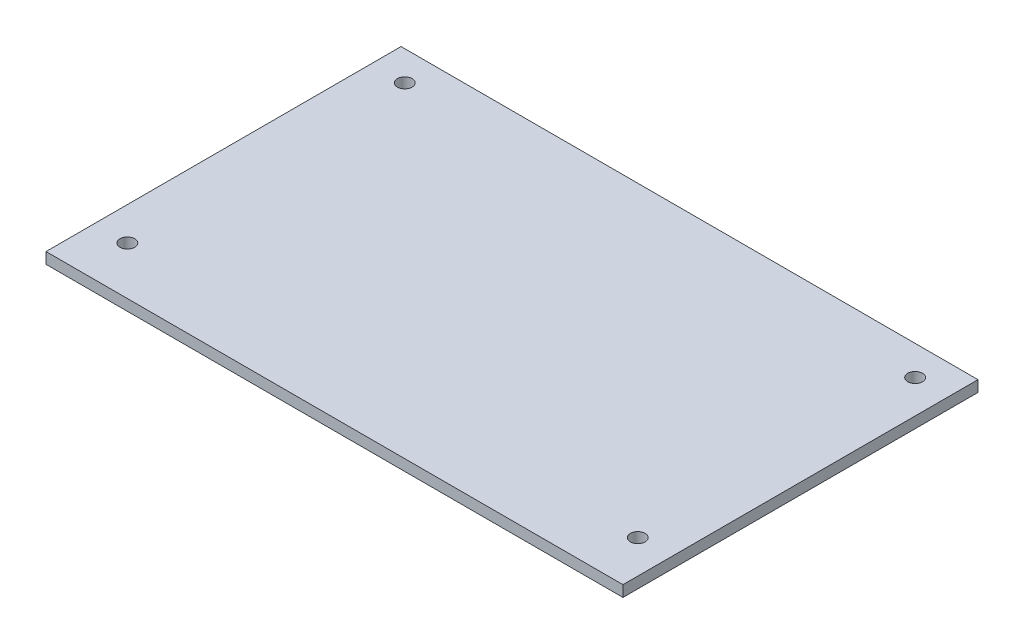
ISO-10303-21;
HEADER;
FILE_DESCRIPTION(('STEP AP214'),'2;1');
FILE_NAME('part.step','',(''),(''),'','','');
FILE_SCHEMA(('AUTOMOTIVE_DESIGN { 1 0 10303 214 1 1 1 1 }'));
ENDSEC;
DATA;
#1=APPLICATION_CONTEXT('core data for automotive mechanical design processes');
#2=APPLICATION_PROTOCOL_DEFINITION('international standard','automotive_design',2000,#1);
#3=PRODUCT_CONTEXT('',#1,'mechanical');
#4=PRODUCT('Part','Part','',(#3));
#5=PRODUCT_RELATED_PRODUCT_CATEGORY('part','',(#4));
#6=PRODUCT_DEFINITION_FORMATION('','',#4);
#7=PRODUCT_DEFINITION_CONTEXT('part definition',#1,'design');
#8=PRODUCT_DEFINITION('design','',#6,#7);
#9=PRODUCT_DEFINITION_SHAPE('','',#8);
#10=(LENGTH_UNIT() NAMED_UNIT(*) SI_UNIT(.MILLI.,.METRE.));
#11=(NAMED_UNIT(*) PLANE_ANGLE_UNIT() SI_UNIT($,.RADIAN.));
#12=(NAMED_UNIT(*) SI_UNIT($,.STERADIAN.) SOLID_ANGLE_UNIT());
#13=UNCERTAINTY_MEASURE_WITH_UNIT(LENGTH_MEASURE(1.E-05),#10,'distance_accuracy_value','');
#14=(GEOMETRIC_REPRESENTATION_CONTEXT(3) GLOBAL_UNCERTAINTY_ASSIGNED_CONTEXT((#13)) GLOBAL_UNIT_ASSIGNED_CONTEXT((#10,
#11,#12)) REPRESENTATION_CONTEXT('',''));
#15=CARTESIAN_POINT('',(0.,0.,0.));
#16=DIRECTION('',(0.,0.,1.));
#17=DIRECTION('',(1.,0.,0.));
#18=AXIS2_PLACEMENT_3D('',#15,#16,#17);
#19=CARTESIAN_POINT('',(-39.,1.5,24.));
#20=DIRECTION('',(1.,0.,0.));
#21=DIRECTION('',(0.,0.,-1.));
#22=AXIS2_PLACEMENT_3D('',#19,#20,#21);
#23=PLANE('',#22);
#24=DIRECTION('',(0.,0.,1.));
#25=VECTOR('',#24,1.);
#26=CARTESIAN_POINT('',(-39.,0.,24.));
#27=LINE('',#26,#25);
#28=CARTESIAN_POINT('',(-39.,0.,-24.));
#29=VERTEX_POINT('',#28);
#30=CARTESIAN_POINT('',(-39.,0.,24.));
#31=VERTEX_POINT('',#30);
#32=EDGE_CURVE('E101',#29,#31,#27,.T.);
#33=ORIENTED_EDGE('',*,*,#32,.T.);
#34=DIRECTION('',(0.,-1.,0.));
#35=VECTOR('',#34,1.);
#36=CARTESIAN_POINT('',(-39.,1.5,24.));
#37=LINE('',#36,#35);
#38=CARTESIAN_POINT('',(-39.,1.5,24.));
#39=VERTEX_POINT('',#38);
#40=EDGE_CURVE('E11',#39,#31,#37,.T.);
#41=ORIENTED_EDGE('',*,*,#40,.F.);
#42=DIRECTION('',(0.,0.,1.));
#43=VECTOR('',#42,1.);
#44=CARTESIAN_POINT('',(-39.,1.5,24.));
#45=LINE('',#44,#43);
#46=CARTESIAN_POINT('',(-39.,1.5,-24.));
#47=VERTEX_POINT('',#46);
#48=EDGE_CURVE('E88',#47,#39,#45,.T.);
#49=ORIENTED_EDGE('',*,*,#48,.F.);
#50=DIRECTION('',(0.,-1.,0.));
#51=VECTOR('',#50,1.);
#52=CARTESIAN_POINT('',(-39.,1.5,-24.));
#53=LINE('',#52,#51);
#54=EDGE_CURVE('E97',#47,#29,#53,.T.);
#55=ORIENTED_EDGE('',*,*,#54,.T.);
#56=EDGE_LOOP('',(#33,#41,#49,#55));
#57=FACE_BOUND('',#56,.T.);
#58=ADVANCED_FACE('F35',(#57),#23,.F.);
#59=CARTESIAN_POINT('',(39.,1.5,24.));
#60=DIRECTION('',(0.,0.,-1.));
#61=DIRECTION('',(-1.,0.,0.));
#62=AXIS2_PLACEMENT_3D('',#59,#60,#61);
#63=PLANE('',#62);
#64=DIRECTION('',(1.,0.,0.));
#65=VECTOR('',#64,1.);
#66=CARTESIAN_POINT('',(39.,0.,24.));
#67=LINE('',#66,#65);
#68=CARTESIAN_POINT('',(39.,0.,24.));
#69=VERTEX_POINT('',#68);
#70=EDGE_CURVE('E92',#31,#69,#67,.T.);
#71=ORIENTED_EDGE('',*,*,#70,.T.);
#72=DIRECTION('',(0.,-1.,0.));
#73=VECTOR('',#72,1.);
#74=CARTESIAN_POINT('',(39.,1.5,24.));
#75=LINE('',#74,#73);
#76=CARTESIAN_POINT('',(39.,1.5,24.));
#77=VERTEX_POINT('',#76);
#78=EDGE_CURVE('E44',#77,#69,#75,.T.);
#79=ORIENTED_EDGE('',*,*,#78,.F.);
#80=DIRECTION('',(1.,0.,0.));
#81=VECTOR('',#80,1.);
#82=CARTESIAN_POINT('',(39.,1.5,24.));
#83=LINE('',#82,#81);
#84=EDGE_CURVE('E83',#39,#77,#83,.T.);
#85=ORIENTED_EDGE('',*,*,#84,.F.);
#86=ORIENTED_EDGE('',*,*,#40,.T.);
#87=EDGE_LOOP('',(#71,#79,#85,#86));
#88=FACE_BOUND('',#87,.T.);
#89=ADVANCED_FACE('F91',(#88),#63,.F.);
#90=CARTESIAN_POINT('',(39.,1.5,24.));
#91=DIRECTION('',(-1.,0.,0.));
#92=DIRECTION('',(0.,0.,1.));
#93=AXIS2_PLACEMENT_3D('',#90,#91,#92);
#94=PLANE('',#93);
#95=DIRECTION('',(0.,0.,-1.));
#96=VECTOR('',#95,1.);
#97=CARTESIAN_POINT('',(39.,0.,24.));
#98=LINE('',#97,#96);
#99=CARTESIAN_POINT('',(39.,0.,-24.));
#100=VERTEX_POINT('',#99);
#101=EDGE_CURVE('E70',#69,#100,#98,.T.);
#102=ORIENTED_EDGE('',*,*,#101,.T.);
#103=DIRECTION('',(0.,-1.,0.));
#104=VECTOR('',#103,1.);
#105=CARTESIAN_POINT('',(39.,1.5,-24.));
#106=LINE('',#105,#104);
#107=CARTESIAN_POINT('',(39.,1.5,-24.));
#108=VERTEX_POINT('',#107);
#109=EDGE_CURVE('E93',#108,#100,#106,.T.);
#110=ORIENTED_EDGE('',*,*,#109,.F.);
#111=DIRECTION('',(0.,0.,-1.));
#112=VECTOR('',#111,1.);
#113=CARTESIAN_POINT('',(39.,1.5,24.));
#114=LINE('',#113,#112);
#115=EDGE_CURVE('E86',#77,#108,#114,.T.);
#116=ORIENTED_EDGE('',*,*,#115,.F.);
#117=ORIENTED_EDGE('',*,*,#78,.T.);
#118=EDGE_LOOP('',(#102,#110,#116,#117));
#119=FACE_BOUND('',#118,.T.);
#120=ADVANCED_FACE('F95',(#119),#94,.F.);
#121=CARTESIAN_POINT('',(39.,1.5,-24.));
#122=DIRECTION('',(0.,0.,1.));
#123=DIRECTION('',(1.,0.,0.));
#124=AXIS2_PLACEMENT_3D('',#121,#122,#123);
#125=PLANE('',#124);
#126=DIRECTION('',(-1.,0.,0.));
#127=VECTOR('',#126,1.);
#128=CARTESIAN_POINT('',(39.,0.,-24.));
#129=LINE('',#128,#127);
#130=EDGE_CURVE('E76',#100,#29,#129,.T.);
#131=ORIENTED_EDGE('',*,*,#130,.T.);
#132=ORIENTED_EDGE('',*,*,#54,.F.);
#133=DIRECTION('',(-1.,0.,0.));
#134=VECTOR('',#133,1.);
#135=CARTESIAN_POINT('',(39.,1.5,-24.));
#136=LINE('',#135,#134);
#137=EDGE_CURVE('E53',#108,#47,#136,.T.);
#138=ORIENTED_EDGE('',*,*,#137,.F.);
#139=ORIENTED_EDGE('',*,*,#109,.T.);
#140=EDGE_LOOP('',(#131,#132,#138,#139));
#141=FACE_BOUND('',#140,.T.);
#142=ADVANCED_FACE('F153',(#141),#125,.F.);
#143=CARTESIAN_POINT('',(0.,1.5,0.));
#144=DIRECTION('',(0.,1.,0.));
#145=DIRECTION('',(0.,0.,1.));
#146=AXIS2_PLACEMENT_3D('',#143,#144,#145);
#147=PLANE('',#146);
#148=CARTESIAN_POINT('',(34.5,1.5,-20.));
#149=DIRECTION('',(0.,1.,0.));
#150=DIRECTION('',(0.,0.,1.));
#151=AXIS2_PLACEMENT_3D('',#148,#149,#150);
#152=CIRCLE('',#151,0.999999999999998);
#153=CARTESIAN_POINT('',(34.5,1.5,-19.));
#154=VERTEX_POINT('',#153);
#155=EDGE_CURVE('E219',#154,#154,#152,.T.);
#156=ORIENTED_EDGE('',*,*,#155,.F.);
#157=EDGE_LOOP('',(#156));
#158=FACE_BOUND('',#157,.T.);
#159=CARTESIAN_POINT('',(-34.5,1.5,17.5));
#160=DIRECTION('',(0.,1.,0.));
#161=DIRECTION('',(0.,0.,1.));
#162=AXIS2_PLACEMENT_3D('',#159,#160,#161);
#163=CIRCLE('',#162,0.999999999999998);
#164=CARTESIAN_POINT('',(-34.5,1.5,18.5));
#165=VERTEX_POINT('',#164);
#166=EDGE_CURVE('E216',#165,#165,#163,.T.);
#167=ORIENTED_EDGE('',*,*,#166,.F.);
#168=EDGE_LOOP('',(#167));
#169=FACE_BOUND('',#168,.T.);
#170=CARTESIAN_POINT('',(34.5,1.5,17.5));
#171=DIRECTION('',(0.,1.,0.));
#172=DIRECTION('',(0.,0.,1.));
#173=AXIS2_PLACEMENT_3D('',#170,#171,#172);
#174=CIRCLE('',#173,1.00000000000001);
#175=CARTESIAN_POINT('',(34.5,1.5,18.5));
#176=VERTEX_POINT('',#175);
#177=EDGE_CURVE('E209',#176,#176,#174,.T.);
#178=ORIENTED_EDGE('',*,*,#177,.F.);
#179=EDGE_LOOP('',(#178));
#180=FACE_BOUND('',#179,.T.);
#181=CARTESIAN_POINT('',(-34.5,1.5,-20.));
#182=DIRECTION('',(0.,1.,0.));
#183=DIRECTION('',(0.,0.,1.));
#184=AXIS2_PLACEMENT_3D('',#181,#182,#183);
#185=CIRCLE('',#184,0.999999999999998);
#186=CARTESIAN_POINT('',(-34.5,1.5,-19.));
#187=VERTEX_POINT('',#186);
#188=EDGE_CURVE('E113',#187,#187,#185,.T.);
#189=ORIENTED_EDGE('',*,*,#188,.F.);
#190=EDGE_LOOP('',(#189));
#191=FACE_BOUND('',#190,.T.);
#192=ORIENTED_EDGE('',*,*,#48,.T.);
#193=ORIENTED_EDGE('',*,*,#84,.T.);
#194=ORIENTED_EDGE('',*,*,#115,.T.);
#195=ORIENTED_EDGE('',*,*,#137,.T.);
#196=EDGE_LOOP('',(#192,#193,#194,#195));
#197=FACE_BOUND('',#196,.T.);
#198=ADVANCED_FACE('F84',(#158,#169,#180,#191,#197),#147,.T.);
#199=CARTESIAN_POINT('',(0.,0.,0.));
#200=DIRECTION('',(0.,1.,0.));
#201=DIRECTION('',(0.,0.,1.));
#202=AXIS2_PLACEMENT_3D('',#199,#200,#201);
#203=PLANE('',#202);
#204=CARTESIAN_POINT('',(34.5,0.,-20.));
#205=DIRECTION('',(0.,1.,0.));
#206=DIRECTION('',(0.,0.,1.));
#207=AXIS2_PLACEMENT_3D('',#204,#205,#206);
#208=CIRCLE('',#207,0.999999999999998);
#209=CARTESIAN_POINT('',(34.5,0.,-19.));
#210=VERTEX_POINT('',#209);
#211=EDGE_CURVE('E38',#210,#210,#208,.T.);
#212=ORIENTED_EDGE('',*,*,#211,.T.);
#213=EDGE_LOOP('',(#212));
#214=FACE_BOUND('',#213,.T.);
#215=CARTESIAN_POINT('',(-34.5,0.,17.5));
#216=DIRECTION('',(0.,1.,0.));
#217=DIRECTION('',(0.,0.,1.));
#218=AXIS2_PLACEMENT_3D('',#215,#216,#217);
#219=CIRCLE('',#218,0.999999999999998);
#220=CARTESIAN_POINT('',(-34.5,0.,18.5));
#221=VERTEX_POINT('',#220);
#222=EDGE_CURVE('E115',#221,#221,#219,.T.);
#223=ORIENTED_EDGE('',*,*,#222,.T.);
#224=EDGE_LOOP('',(#223));
#225=FACE_BOUND('',#224,.T.);
#226=CARTESIAN_POINT('',(34.5,0.,17.5));
#227=DIRECTION('',(0.,1.,0.));
#228=DIRECTION('',(0.,0.,1.));
#229=AXIS2_PLACEMENT_3D('',#226,#227,#228);
#230=CIRCLE('',#229,1.00000000000001);
#231=CARTESIAN_POINT('',(34.5,0.,18.5));
#232=VERTEX_POINT('',#231);
#233=EDGE_CURVE('E112',#232,#232,#230,.T.);
#234=ORIENTED_EDGE('',*,*,#233,.T.);
#235=EDGE_LOOP('',(#234));
#236=FACE_BOUND('',#235,.T.);
#237=CARTESIAN_POINT('',(-34.5,0.,-20.));
#238=DIRECTION('',(0.,1.,0.));
#239=DIRECTION('',(0.,0.,1.));
#240=AXIS2_PLACEMENT_3D('',#237,#238,#239);
#241=CIRCLE('',#240,0.999999999999998);
#242=CARTESIAN_POINT('',(-34.5,0.,-19.));
#243=VERTEX_POINT('',#242);
#244=EDGE_CURVE('E109',#243,#243,#241,.T.);
#245=ORIENTED_EDGE('',*,*,#244,.T.);
#246=EDGE_LOOP('',(#245));
#247=FACE_BOUND('',#246,.T.);
#248=ORIENTED_EDGE('',*,*,#32,.F.);
#249=ORIENTED_EDGE('',*,*,#130,.F.);
#250=ORIENTED_EDGE('',*,*,#101,.F.);
#251=ORIENTED_EDGE('',*,*,#70,.F.);
#252=EDGE_LOOP('',(#248,#249,#250,#251));
#253=FACE_BOUND('',#252,.T.);
#254=ADVANCED_FACE('F122',(#214,#225,#236,#247,#253),#203,.F.);
#255=CARTESIAN_POINT('',(-34.5,-8.5,-20.));
#256=DIRECTION('',(0.,1.,0.));
#257=DIRECTION('',(0.,0.,1.));
#258=AXIS2_PLACEMENT_3D('',#255,#256,#257);
#259=CYLINDRICAL_SURFACE('',#258,0.999999999999998);
#260=ORIENTED_EDGE('',*,*,#188,.T.);
#261=EDGE_LOOP('',(#260));
#262=FACE_BOUND('',#261,.T.);
#263=ORIENTED_EDGE('',*,*,#244,.F.);
#264=EDGE_LOOP('',(#263));
#265=FACE_BOUND('',#264,.T.);
#266=ADVANCED_FACE('F145',(#262,#265),#259,.F.);
#267=CARTESIAN_POINT('',(34.5,-8.5,17.5));
#268=DIRECTION('',(0.,1.,0.));
#269=DIRECTION('',(0.,0.,1.));
#270=AXIS2_PLACEMENT_3D('',#267,#268,#269);
#271=CYLINDRICAL_SURFACE('',#270,1.00000000000001);
#272=ORIENTED_EDGE('',*,*,#177,.T.);
#273=EDGE_LOOP('',(#272));
#274=FACE_BOUND('',#273,.T.);
#275=ORIENTED_EDGE('',*,*,#233,.F.);
#276=EDGE_LOOP('',(#275));
#277=FACE_BOUND('',#276,.T.);
#278=ADVANCED_FACE('F132',(#274,#277),#271,.F.);
#279=CARTESIAN_POINT('',(-34.5,-8.5,17.5));
#280=DIRECTION('',(0.,1.,0.));
#281=DIRECTION('',(0.,0.,1.));
#282=AXIS2_PLACEMENT_3D('',#279,#280,#281);
#283=CYLINDRICAL_SURFACE('',#282,0.999999999999998);
#284=ORIENTED_EDGE('',*,*,#166,.T.);
#285=EDGE_LOOP('',(#284));
#286=FACE_BOUND('',#285,.T.);
#287=ORIENTED_EDGE('',*,*,#222,.F.);
#288=EDGE_LOOP('',(#287));
#289=FACE_BOUND('',#288,.T.);
#290=ADVANCED_FACE('F126',(#286,#289),#283,.F.);
#291=CARTESIAN_POINT('',(34.5,-8.5,-20.));
#292=DIRECTION('',(0.,1.,0.));
#293=DIRECTION('',(0.,0.,1.));
#294=AXIS2_PLACEMENT_3D('',#291,#292,#293);
#295=CYLINDRICAL_SURFACE('',#294,0.999999999999998);
#296=ORIENTED_EDGE('',*,*,#155,.T.);
#297=EDGE_LOOP('',(#296));
#298=FACE_BOUND('',#297,.T.);
#299=ORIENTED_EDGE('',*,*,#211,.F.);
#300=EDGE_LOOP('',(#299));
#301=FACE_BOUND('',#300,.T.);
#302=ADVANCED_FACE('F124',(#298,#301),#295,.F.);
#303=CLOSED_SHELL('',(#58,#89,#120,#142,#198,#254,#266,#278,#290,#302));
#304=MANIFOLD_SOLID_BREP('B2',#303);
#305=ADVANCED_BREP_SHAPE_REPRESENTATION('',(#18,#304),#14);
#306=SHAPE_DEFINITION_REPRESENTATION(#9,#305);
ENDSEC;
END-ISO-10303-21;
